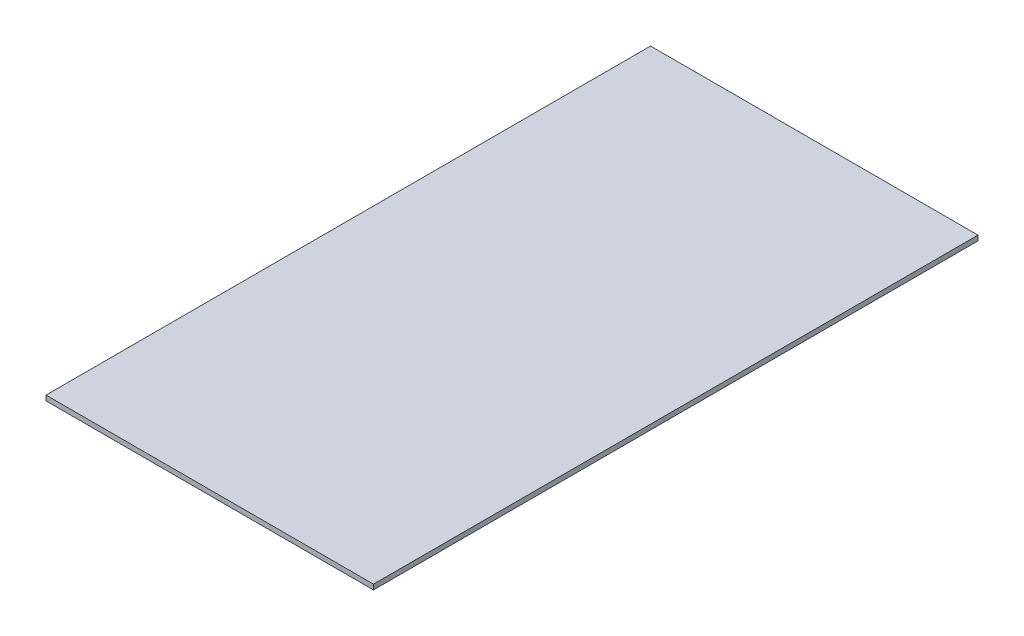
ISO-10303-21;
HEADER;
FILE_DESCRIPTION(('STEP AP214'),'2;1');
FILE_NAME('part.step','',(''),(''),'','','');
FILE_SCHEMA(('AUTOMOTIVE_DESIGN { 1 0 10303 214 1 1 1 1 }'));
ENDSEC;
DATA;
#1=APPLICATION_CONTEXT('core data for automotive mechanical design processes');
#2=APPLICATION_PROTOCOL_DEFINITION('international standard','automotive_design',2000,#1);
#3=PRODUCT_CONTEXT('',#1,'mechanical');
#4=PRODUCT('Part','Part','',(#3));
#5=PRODUCT_RELATED_PRODUCT_CATEGORY('part','',(#4));
#6=PRODUCT_DEFINITION_FORMATION('','',#4);
#7=PRODUCT_DEFINITION_CONTEXT('part definition',#1,'design');
#8=PRODUCT_DEFINITION('design','',#6,#7);
#9=PRODUCT_DEFINITION_SHAPE('','',#8);
#10=(LENGTH_UNIT() NAMED_UNIT(*) SI_UNIT(.MILLI.,.METRE.));
#11=(NAMED_UNIT(*) PLANE_ANGLE_UNIT() SI_UNIT($,.RADIAN.));
#12=(NAMED_UNIT(*) SI_UNIT($,.STERADIAN.) SOLID_ANGLE_UNIT());
#13=UNCERTAINTY_MEASURE_WITH_UNIT(LENGTH_MEASURE(1.E-05),#10,'distance_accuracy_value','');
#14=(GEOMETRIC_REPRESENTATION_CONTEXT(3) GLOBAL_UNCERTAINTY_ASSIGNED_CONTEXT((#13)) GLOBAL_UNIT_ASSIGNED_CONTEXT((#10,
#11,#12)) REPRESENTATION_CONTEXT('',''));
#15=CARTESIAN_POINT('',(0.,0.,0.));
#16=DIRECTION('',(0.,0.,1.));
#17=DIRECTION('',(1.,0.,0.));
#18=AXIS2_PLACEMENT_3D('',#15,#16,#17);
#19=CARTESIAN_POINT('',(32.5,1.,-60.));
#20=DIRECTION('',(-1.,0.,0.));
#21=DIRECTION('',(0.,0.,1.));
#22=AXIS2_PLACEMENT_3D('',#19,#20,#21);
#23=PLANE('',#22);
#24=DIRECTION('',(0.,0.,-1.));
#25=VECTOR('',#24,1.);
#26=CARTESIAN_POINT('',(32.5,0.,-60.));
#27=LINE('',#26,#25);
#28=CARTESIAN_POINT('',(32.5,0.,60.));
#29=VERTEX_POINT('',#28);
#30=CARTESIAN_POINT('',(32.5,0.,-60.));
#31=VERTEX_POINT('',#30);
#32=EDGE_CURVE('E97',#29,#31,#27,.T.);
#33=ORIENTED_EDGE('',*,*,#32,.T.);
#34=DIRECTION('',(0.,-1.,0.));
#35=VECTOR('',#34,1.);
#36=CARTESIAN_POINT('',(32.5,1.,-60.));
#37=LINE('',#36,#35);
#38=CARTESIAN_POINT('',(32.5,1.,-60.));
#39=VERTEX_POINT('',#38);
#40=EDGE_CURVE('E11',#39,#31,#37,.T.);
#41=ORIENTED_EDGE('',*,*,#40,.F.);
#42=DIRECTION('',(0.,0.,-1.));
#43=VECTOR('',#42,1.);
#44=CARTESIAN_POINT('',(32.5,1.,-60.));
#45=LINE('',#44,#43);
#46=CARTESIAN_POINT('',(32.5,1.,60.));
#47=VERTEX_POINT('',#46);
#48=EDGE_CURVE('E85',#47,#39,#45,.T.);
#49=ORIENTED_EDGE('',*,*,#48,.F.);
#50=DIRECTION('',(0.,-1.,0.));
#51=VECTOR('',#50,1.);
#52=CARTESIAN_POINT('',(32.5,1.,60.));
#53=LINE('',#52,#51);
#54=EDGE_CURVE('E93',#47,#29,#53,.T.);
#55=ORIENTED_EDGE('',*,*,#54,.T.);
#56=EDGE_LOOP('',(#33,#41,#49,#55));
#57=FACE_BOUND('',#56,.T.);
#58=ADVANCED_FACE('F34',(#57),#23,.F.);
#59=CARTESIAN_POINT('',(-32.5,1.,-60.));
#60=DIRECTION('',(0.,0.,1.));
#61=DIRECTION('',(1.,0.,0.));
#62=AXIS2_PLACEMENT_3D('',#59,#60,#61);
#63=PLANE('',#62);
#64=DIRECTION('',(-1.,0.,0.));
#65=VECTOR('',#64,1.);
#66=CARTESIAN_POINT('',(-32.5,0.,-60.));
#67=LINE('',#66,#65);
#68=CARTESIAN_POINT('',(-32.5,0.,-60.));
#69=VERTEX_POINT('',#68);
#70=EDGE_CURVE('E89',#31,#69,#67,.T.);
#71=ORIENTED_EDGE('',*,*,#70,.T.);
#72=DIRECTION('',(0.,-1.,0.));
#73=VECTOR('',#72,1.);
#74=CARTESIAN_POINT('',(-32.5,1.,-60.));
#75=LINE('',#74,#73);
#76=CARTESIAN_POINT('',(-32.5,1.,-60.));
#77=VERTEX_POINT('',#76);
#78=EDGE_CURVE('E42',#77,#69,#75,.T.);
#79=ORIENTED_EDGE('',*,*,#78,.F.);
#80=DIRECTION('',(-1.,0.,0.));
#81=VECTOR('',#80,1.);
#82=CARTESIAN_POINT('',(-32.5,1.,-60.));
#83=LINE('',#82,#81);
#84=EDGE_CURVE('E80',#39,#77,#83,.T.);
#85=ORIENTED_EDGE('',*,*,#84,.F.);
#86=ORIENTED_EDGE('',*,*,#40,.T.);
#87=EDGE_LOOP('',(#71,#79,#85,#86));
#88=FACE_BOUND('',#87,.T.);
#89=ADVANCED_FACE('F88',(#88),#63,.F.);
#90=CARTESIAN_POINT('',(-32.5,1.,-60.));
#91=DIRECTION('',(1.,0.,0.));
#92=DIRECTION('',(0.,0.,-1.));
#93=AXIS2_PLACEMENT_3D('',#90,#91,#92);
#94=PLANE('',#93);
#95=DIRECTION('',(0.,0.,1.));
#96=VECTOR('',#95,1.);
#97=CARTESIAN_POINT('',(-32.5,0.,-60.));
#98=LINE('',#97,#96);
#99=CARTESIAN_POINT('',(-32.5,0.,60.));
#100=VERTEX_POINT('',#99);
#101=EDGE_CURVE('E67',#69,#100,#98,.T.);
#102=ORIENTED_EDGE('',*,*,#101,.T.);
#103=DIRECTION('',(0.,-1.,0.));
#104=VECTOR('',#103,1.);
#105=CARTESIAN_POINT('',(-32.5,1.,60.));
#106=LINE('',#105,#104);
#107=CARTESIAN_POINT('',(-32.5,1.,60.));
#108=VERTEX_POINT('',#107);
#109=EDGE_CURVE('E90',#108,#100,#106,.T.);
#110=ORIENTED_EDGE('',*,*,#109,.F.);
#111=DIRECTION('',(0.,0.,1.));
#112=VECTOR('',#111,1.);
#113=CARTESIAN_POINT('',(-32.5,1.,-60.));
#114=LINE('',#113,#112);
#115=EDGE_CURVE('E83',#77,#108,#114,.T.);
#116=ORIENTED_EDGE('',*,*,#115,.F.);
#117=ORIENTED_EDGE('',*,*,#78,.T.);
#118=EDGE_LOOP('',(#102,#110,#116,#117));
#119=FACE_BOUND('',#118,.T.);
#120=ADVANCED_FACE('F91',(#119),#94,.F.);
#121=CARTESIAN_POINT('',(-32.5,1.,60.));
#122=DIRECTION('',(0.,0.,-1.));
#123=DIRECTION('',(-1.,0.,0.));
#124=AXIS2_PLACEMENT_3D('',#121,#122,#123);
#125=PLANE('',#124);
#126=DIRECTION('',(1.,0.,0.));
#127=VECTOR('',#126,1.);
#128=CARTESIAN_POINT('',(-32.5,0.,60.));
#129=LINE('',#128,#127);
#130=EDGE_CURVE('E73',#100,#29,#129,.T.);
#131=ORIENTED_EDGE('',*,*,#130,.T.);
#132=ORIENTED_EDGE('',*,*,#54,.F.);
#133=DIRECTION('',(1.,0.,0.));
#134=VECTOR('',#133,1.);
#135=CARTESIAN_POINT('',(-32.5,1.,60.));
#136=LINE('',#135,#134);
#137=EDGE_CURVE('E50',#108,#47,#136,.T.);
#138=ORIENTED_EDGE('',*,*,#137,.F.);
#139=ORIENTED_EDGE('',*,*,#109,.T.);
#140=EDGE_LOOP('',(#131,#132,#138,#139));
#141=FACE_BOUND('',#140,.T.);
#142=ADVANCED_FACE('F104',(#141),#125,.F.);
#143=CARTESIAN_POINT('',(0.,1.,0.));
#144=DIRECTION('',(0.,1.,0.));
#145=DIRECTION('',(0.,0.,1.));
#146=AXIS2_PLACEMENT_3D('',#143,#144,#145);
#147=PLANE('',#146);
#148=ORIENTED_EDGE('',*,*,#48,.T.);
#149=ORIENTED_EDGE('',*,*,#84,.T.);
#150=ORIENTED_EDGE('',*,*,#115,.T.);
#151=ORIENTED_EDGE('',*,*,#137,.T.);
#152=EDGE_LOOP('',(#148,#149,#150,#151));
#153=FACE_BOUND('',#152,.T.);
#154=ADVANCED_FACE('F81',(#153),#147,.T.);
#155=CARTESIAN_POINT('',(0.,0.,0.));
#156=DIRECTION('',(0.,1.,0.));
#157=DIRECTION('',(0.,0.,1.));
#158=AXIS2_PLACEMENT_3D('',#155,#156,#157);
#159=PLANE('',#158);
#160=ORIENTED_EDGE('',*,*,#32,.F.);
#161=ORIENTED_EDGE('',*,*,#130,.F.);
#162=ORIENTED_EDGE('',*,*,#101,.F.);
#163=ORIENTED_EDGE('',*,*,#70,.F.);
#164=EDGE_LOOP('',(#160,#161,#162,#163));
#165=FACE_BOUND('',#164,.T.);
#166=ADVANCED_FACE('F107',(#165),#159,.F.);
#167=CLOSED_SHELL('',(#58,#89,#120,#142,#154,#166));
#168=MANIFOLD_SOLID_BREP('B2',#167);
#169=ADVANCED_BREP_SHAPE_REPRESENTATION('',(#18,#168),#14);
#170=SHAPE_DEFINITION_REPRESENTATION(#9,#169);
ENDSEC;
END-ISO-10303-21;
